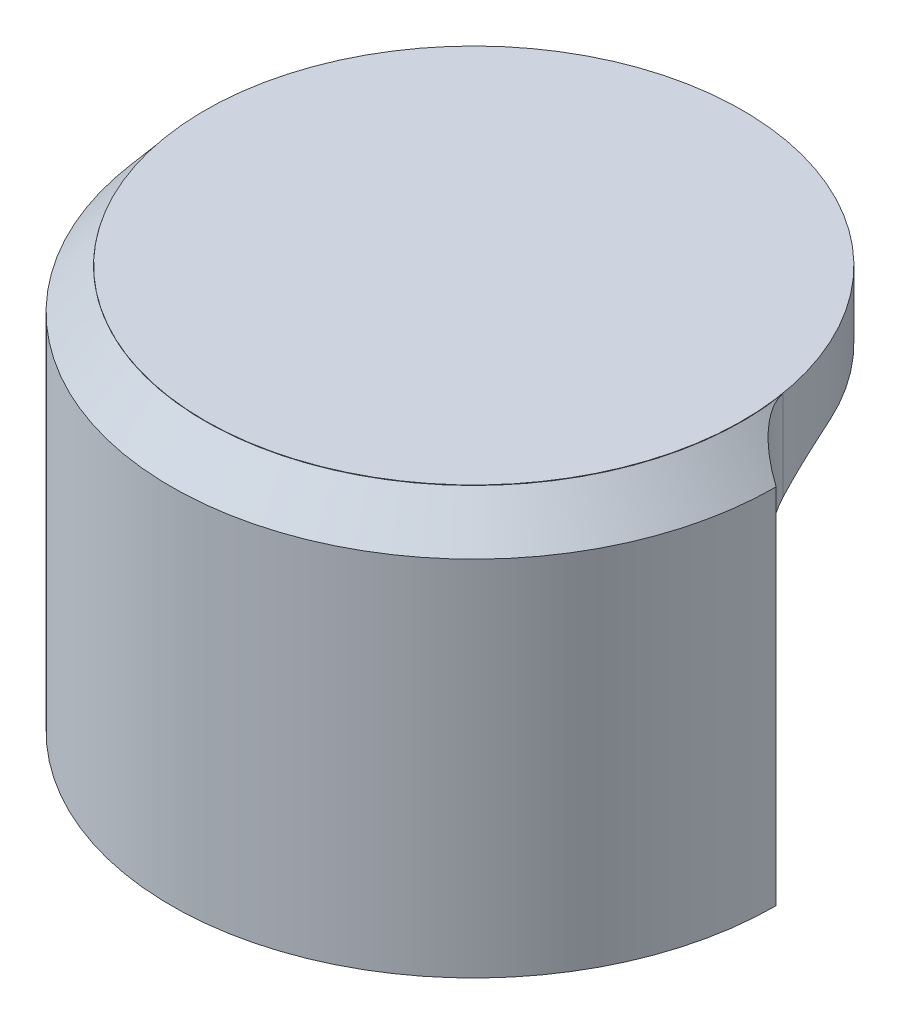
ISO-10303-21;
HEADER;
FILE_DESCRIPTION(('STEP AP214'),'2;1');
FILE_NAME('part.step','',(''),(''),'','','');
FILE_SCHEMA(('AUTOMOTIVE_DESIGN { 1 0 10303 214 1 1 1 1 }'));
ENDSEC;
DATA;
#1=APPLICATION_CONTEXT('core data for automotive mechanical design processes');
#2=APPLICATION_PROTOCOL_DEFINITION('international standard','automotive_design',2000,#1);
#3=PRODUCT_CONTEXT('',#1,'mechanical');
#4=PRODUCT('Part','Part','',(#3));
#5=PRODUCT_RELATED_PRODUCT_CATEGORY('part','',(#4));
#6=PRODUCT_DEFINITION_FORMATION('','',#4);
#7=PRODUCT_DEFINITION_CONTEXT('part definition',#1,'design');
#8=PRODUCT_DEFINITION('design','',#6,#7);
#9=PRODUCT_DEFINITION_SHAPE('','',#8);
#10=(LENGTH_UNIT() NAMED_UNIT(*) SI_UNIT(.MILLI.,.METRE.));
#11=(NAMED_UNIT(*) PLANE_ANGLE_UNIT() SI_UNIT($,.RADIAN.));
#12=(NAMED_UNIT(*) SI_UNIT($,.STERADIAN.) SOLID_ANGLE_UNIT());
#13=UNCERTAINTY_MEASURE_WITH_UNIT(LENGTH_MEASURE(1.E-05),#10,'distance_accuracy_value','');
#14=(GEOMETRIC_REPRESENTATION_CONTEXT(3) GLOBAL_UNCERTAINTY_ASSIGNED_CONTEXT((#13)) GLOBAL_UNIT_ASSIGNED_CONTEXT((#10,
#11,#12)) REPRESENTATION_CONTEXT('',''));
#15=CARTESIAN_POINT('',(0.,0.,0.));
#16=DIRECTION('',(0.,0.,1.));
#17=DIRECTION('',(1.,0.,0.));
#18=AXIS2_PLACEMENT_3D('',#15,#16,#17);
#19=CARTESIAN_POINT('',(0.,30.,0.));
#20=DIRECTION('',(0.,-1.,0.));
#21=DIRECTION('',(0.,0.,-1.));
#22=AXIS2_PLACEMENT_3D('',#19,#20,#21);
#23=CYLINDRICAL_SURFACE('',#22,20.);
#24=CARTESIAN_POINT('',(0.,0.,0.));
#25=DIRECTION('',(0.,-1.,0.));
#26=DIRECTION('',(0.,0.,-1.));
#27=AXIS2_PLACEMENT_3D('',#24,#25,#26);
#28=CIRCLE('',#27,20.);
#29=CARTESIAN_POINT('',(20.,0.,0.));
#30=VERTEX_POINT('',#29);
#31=CARTESIAN_POINT('',(-20.,0.,0.));
#32=VERTEX_POINT('',#31);
#33=EDGE_CURVE('E127',#30,#32,#28,.T.);
#34=ORIENTED_EDGE('',*,*,#33,.T.);
#35=DIRECTION('',(0.,-1.,0.));
#36=VECTOR('',#35,1.);
#37=CARTESIAN_POINT('',(-20.,30.,0.));
#38=LINE('',#37,#36);
#39=CARTESIAN_POINT('',(-20.,20.,0.));
#40=VERTEX_POINT('',#39);
#41=EDGE_CURVE('E113',#40,#32,#38,.T.);
#42=ORIENTED_EDGE('',*,*,#41,.F.);
#43=CARTESIAN_POINT('',(-20.,20.,0.));
#44=CARTESIAN_POINT('',(-19.9999557370953,20.2805626373853,2.9943857944968E-05));
#45=CARTESIAN_POINT('',(-19.9999986078176,20.5611210251892,-0.0118060572730324));
#46=CARTESIAN_POINT('',(-19.9999387337623,21.1202432263666,-0.0589939019382653));
#47=CARTESIAN_POINT('',(-19.9998359944431,21.3988071141145,-0.0943448639401671));
#48=CARTESIAN_POINT('',(-19.9991651639557,21.9518916713769,-0.188332355567512));
#49=CARTESIAN_POINT('',(-19.9985972139569,22.2264135417299,-0.246961818491311));
#50=CARTESIAN_POINT('',(-19.9963773522755,22.7695525530659,-0.387080348755982));
#51=CARTESIAN_POINT('',(-19.9947254540536,23.0381697673315,-0.468569132217734));
#52=CARTESIAN_POINT('',(-19.989522603102,23.5677616164803,-0.653886785261698));
#53=CARTESIAN_POINT('',(-19.9859704300935,23.8287312266746,-0.757729984299086));
#54=CARTESIAN_POINT('',(-19.9759617833958,24.3409674737002,-0.986968781670475));
#55=CARTESIAN_POINT('',(-19.9695053549892,24.5922342617499,-1.11236404394935));
#56=CARTESIAN_POINT('',(-19.9525359716774,25.0832085593254,-1.38375620847462));
#57=CARTESIAN_POINT('',(-19.9420234855485,25.3229174010533,-1.52975072873829));
#58=CARTESIAN_POINT('',(-19.9156807366992,25.7890239179821,-1.84121562157234));
#59=CARTESIAN_POINT('',(-19.8998505678017,26.0154218279526,-2.00668565049168));
#60=CARTESIAN_POINT('',(-19.8617485317303,26.4509585511862,-2.35396115093738));
#61=CARTESIAN_POINT('',(-19.8395441677449,26.6602501346368,-2.53558234570398));
#62=CARTESIAN_POINT('',(-19.7873511781658,27.0625518023257,-2.91502911047923));
#63=CARTESIAN_POINT('',(-19.7573625822775,27.2555619486918,-3.11285461864856));
#64=CARTESIAN_POINT('',(-19.6884046394683,27.6237303156232,-3.52276504570011));
#65=CARTESIAN_POINT('',(-19.6494418276717,27.7989013935786,-3.73483950912087));
#66=CARTESIAN_POINT('',(-19.5614292641474,28.1302973958213,-4.17133454832747));
#67=CARTESIAN_POINT('',(-19.5123799914951,28.286523219389,-4.39575453736869));
#68=CARTESIAN_POINT('',(-19.4055291021525,28.5730280044983,-4.84526519222889));
#69=CARTESIAN_POINT('',(-19.3481692420369,28.7041086431448,-5.06995042531681));
#70=CARTESIAN_POINT('',(-19.2227487020385,28.947317246645,-5.52647769706414));
#71=CARTESIAN_POINT('',(-19.154688097627,29.0594453451578,-5.75831968523834));
#72=CARTESIAN_POINT('',(-19.007432782435,29.2645281224053,-6.22719365358695));
#73=CARTESIAN_POINT('',(-18.9282267177046,29.3574630076423,-6.46423071549735));
#74=CARTESIAN_POINT('',(-18.7586219733123,29.5239993517451,-6.94104569878217));
#75=CARTESIAN_POINT('',(-18.6682242367918,29.597602438105,-7.1808233876556));
#76=CARTESIAN_POINT('',(-18.4852716379337,29.7198302561806,-7.63870144767882));
#77=CARTESIAN_POINT('',(-18.3936964321844,29.7701397092871,-7.85674735972423));
#78=CARTESIAN_POINT('',(-18.2016664772038,29.8555380220128,-8.29191863880495));
#79=CARTESIAN_POINT('',(-18.101211179975,29.8906259415087,-8.50904394816144));
#80=CARTESIAN_POINT('',(-17.8919969567306,29.9460956297941,-8.94056832620431));
#81=CARTESIAN_POINT('',(-17.7832558670354,29.9665080528281,-9.1549721532543));
#82=CARTESIAN_POINT('',(-17.5577747522793,29.9934653907493,-9.58033020860675));
#83=CARTESIAN_POINT('',(-17.4410375485944,30.0000151712221,-9.7912856214477));
#84=CARTESIAN_POINT('',(-17.3205080756888,30.,-10.));
#85=B_SPLINE_CURVE_WITH_KNOTS('',3,(#43,#44,#45,#46,#47,#48,#49,#50,#51,#52,#53,#54,#55,#56,#57,
#58,#59,#60,#61,#62,#63,#64,#65,#66,#67,#68,#69,#70,#71,#72,#73,#74,#75,#76,#77,#78,#79,#80,#81,
#82,#83,#84),.UNSPECIFIED.,.F.,.F.,(4,2,2,2,2,2,2,2,2,2,2,2,2,2,2,2,2,2,2,2,4),(0.,
0.841432372616268,1.68283320326807,2.5239788032209,3.36511395784561,4.20678990454418,
5.04845272842231,5.89001830677084,6.73156903767482,7.56451718005767,8.3974621438706,
9.22980245490531,10.0621032415009,10.8602498176647,11.6583907648246,12.4573507499772,
13.2562434511754,13.9809573838289,14.7057160704186,15.4289564442854,16.1519429291931),.UNSPECIFIED.);
#86=CARTESIAN_POINT('',(-17.3205080756888,30.,-10.));
#87=VERTEX_POINT('',#86);
#88=EDGE_CURVE('E11',#40,#87,#85,.T.);
#89=ORIENTED_EDGE('',*,*,#88,.T.);
#90=CARTESIAN_POINT('',(0.,30.,0.));
#91=DIRECTION('',(0.,-1.,0.));
#92=DIRECTION('',(0.,0.,-1.));
#93=AXIS2_PLACEMENT_3D('',#90,#91,#92);
#94=CIRCLE('',#93,20.);
#95=CARTESIAN_POINT('',(17.3205080756888,30.,-10.));
#96=VERTEX_POINT('',#95);
#97=EDGE_CURVE('E99',#96,#87,#94,.T.);
#98=ORIENTED_EDGE('',*,*,#97,.F.);
#99=CARTESIAN_POINT('',(17.3205080756888,30.,-10.));
#100=CARTESIAN_POINT('',(17.459612415594,30.0000289828941,-9.75915325547947));
#101=CARTESIAN_POINT('',(17.5936559303901,29.9912982661973,-9.51529333613806));
#102=CARTESIAN_POINT('',(17.8510321720107,29.9552269450601,-9.02315548704157));
#103=CARTESIAN_POINT('',(17.9743582486052,29.9278748776406,-8.77487492775037));
#104=CARTESIAN_POINT('',(18.2096966668275,29.853417275292,-8.27546730681567));
#105=CARTESIAN_POINT('',(18.3216934593926,29.8062850372674,-8.02433684540639));
#106=CARTESIAN_POINT('',(18.5336859705613,29.6914766887072,-7.52175613948921));
#107=CARTESIAN_POINT('',(18.633684333424,29.6238051163536,-7.27030597782844));
#108=CARTESIAN_POINT('',(18.8218407710521,29.4670902166284,-6.76834212010999));
#109=CARTESIAN_POINT('',(18.9099483557127,29.3779599687156,-6.51783655304953));
#110=CARTESIAN_POINT('',(19.0738581333725,29.178327741808,-6.02131990188398));
#111=CARTESIAN_POINT('',(19.1496593574931,29.0678240815861,-5.77530917300889));
#112=CARTESIAN_POINT('',(19.2891545861386,28.8258796864667,-5.29074625413785));
#113=CARTESIAN_POINT('',(19.3528668826701,28.6944711461643,-5.05218325929774));
#114=CARTESIAN_POINT('',(19.4689275565784,28.4112143223625,-4.58463553736811));
#115=CARTESIAN_POINT('',(19.5212766296463,28.2593672910921,-4.35565022459721));
#116=CARTESIAN_POINT('',(19.6126912099352,27.9457410530995,-3.92280009919124));
#117=CARTESIAN_POINT('',(19.6523591542812,27.7850800902642,-3.71825052877836));
#118=CARTESIAN_POINT('',(19.7232936928387,27.4475068264008,-3.32149114715562));
#119=CARTESIAN_POINT('',(19.7545605865166,27.2705951049537,-3.12928089628082));
#120=CARTESIAN_POINT('',(19.8097149968838,26.9015743178437,-2.75868119688005));
#121=CARTESIAN_POINT('',(19.8335980592366,26.7094561662398,-2.58030013931034));
#122=CARTESIAN_POINT('',(19.8750343291867,26.3114025127017,-2.23888172518596));
#123=CARTESIAN_POINT('',(19.8925873914606,26.1054666936718,-2.07584472096174));
#124=CARTESIAN_POINT('',(19.9227019851648,25.6776728071139,-1.76378269350275));
#125=CARTESIAN_POINT('',(19.9351768619137,25.455608883857,-1.61503156933063));
#126=CARTESIAN_POINT('',(19.9558389477264,25.0001398792703,-1.33570692752737));
#127=CARTESIAN_POINT('',(19.9640260730185,24.7667345764565,-1.20513376508324));
#128=CARTESIAN_POINT('',(19.9771666714359,24.2901502617058,-0.963073362964116));
#129=CARTESIAN_POINT('',(19.9821201958237,24.0469714047744,-0.851585820744583));
#130=CARTESIAN_POINT('',(19.989743941604,23.5524334729352,-0.648439976445167));
#131=CARTESIAN_POINT('',(19.9924141652643,23.3010744061514,-0.556781654672755));
#132=CARTESIAN_POINT('',(19.9962189021077,22.8007565537338,-0.396755504012646));
#133=CARTESIAN_POINT('',(19.9974040220749,22.5520231169728,-0.327683189203371));
#134=CARTESIAN_POINT('',(19.9989958117031,22.0499618061518,-0.20897345033782));
#135=CARTESIAN_POINT('',(19.9994024966261,21.7966340222662,-0.159335645266037));
#136=CARTESIAN_POINT('',(19.9998827127155,21.2868679523363,-0.0797935346938577));
#137=CARTESIAN_POINT('',(19.9999562030292,21.0304292887339,-0.0498916493837689));
#138=CARTESIAN_POINT('',(19.9999989843423,20.5159948291556,-0.00998366544209926));
#139=CARTESIAN_POINT('',(19.9999682696628,20.2579989490815,2.1348830103851E-05));
#140=CARTESIAN_POINT('',(20.,20.,0.));
#141=B_SPLINE_CURVE_WITH_KNOTS('',3,(#99,#100,#101,#102,#103,#104,#105,#106,#107,#108,#109,#110,
#111,#112,#113,#114,#115,#116,#117,#118,#119,#120,#121,#122,#123,#124,#125,#126,#127,#128,#129,
#130,#131,#132,#133,#134,#135,#136,#137,#138,#139,#140),.UNSPECIFIED.,.F.,.F.,(4,2,2,2,2,2,2,2,
2,2,2,2,2,2,2,2,2,2,2,2,4),(0.,0.834312350280991,1.66913875364591,2.50509581083416,
3.34086829694701,4.18008487221365,5.01936748690845,5.85736985767487,6.6953209089178,
7.48372262446206,8.27209623268632,9.06094450777077,9.84981089198667,10.6516249580703,
11.4534546889452,12.2552717080681,13.0570879308976,13.8307645145586,14.6044259294532,
15.378182199828,16.1519806379827),.UNSPECIFIED.);
#142=CARTESIAN_POINT('',(20.,20.,0.));
#143=VERTEX_POINT('',#142);
#144=EDGE_CURVE('E120',#96,#143,#141,.T.);
#145=ORIENTED_EDGE('',*,*,#144,.T.);
#146=DIRECTION('',(0.,-1.,0.));
#147=VECTOR('',#146,1.);
#148=CARTESIAN_POINT('',(20.,30.,0.));
#149=LINE('',#148,#147);
#150=EDGE_CURVE('E344',#143,#30,#149,.T.);
#151=ORIENTED_EDGE('',*,*,#150,.T.);
#152=EDGE_LOOP('',(#34,#42,#89,#98,#145,#151));
#153=FACE_BOUND('',#152,.T.);
#154=ADVANCED_FACE('F45',(#153),#23,.F.);
#155=CARTESIAN_POINT('',(-27.,30.,0.));
#156=DIRECTION('',(0.,0.,1.));
#157=DIRECTION('',(1.,0.,0.));
#158=AXIS2_PLACEMENT_3D('',#155,#156,#157);
#159=PLANE('',#158);
#160=DIRECTION('',(0.,-1.,0.));
#161=VECTOR('',#160,1.);
#162=CARTESIAN_POINT('',(-27.,30.,0.));
#163=LINE('',#162,#161);
#164=CARTESIAN_POINT('',(-27.,20.,0.));
#165=VERTEX_POINT('',#164);
#166=CARTESIAN_POINT('',(-27.,0.,0.));
#167=VERTEX_POINT('',#166);
#168=EDGE_CURVE('E115',#165,#167,#163,.T.);
#169=ORIENTED_EDGE('',*,*,#168,.F.);
#170=DIRECTION('',(-1.,0.,0.));
#171=VECTOR('',#170,1.);
#172=CARTESIAN_POINT('',(-20.,20.,0.));
#173=LINE('',#172,#171);
#174=EDGE_CURVE('E108',#165,#40,#173,.F.);
#175=ORIENTED_EDGE('',*,*,#174,.T.);
#176=ORIENTED_EDGE('',*,*,#41,.T.);
#177=DIRECTION('',(-1.,0.,0.));
#178=VECTOR('',#177,1.);
#179=CARTESIAN_POINT('',(-27.,0.,0.));
#180=LINE('',#179,#178);
#181=EDGE_CURVE('E339',#32,#167,#180,.T.);
#182=ORIENTED_EDGE('',*,*,#181,.T.);
#183=EDGE_LOOP('',(#169,#175,#176,#182));
#184=FACE_BOUND('',#183,.T.);
#185=ADVANCED_FACE('F110',(#184),#159,.F.);
#186=CARTESIAN_POINT('',(0.,30.,0.));
#187=DIRECTION('',(0.,-1.,0.));
#188=DIRECTION('',(0.,0.,-1.));
#189=AXIS2_PLACEMENT_3D('',#186,#187,#188);
#190=CYLINDRICAL_SURFACE('',#189,27.);
#191=CARTESIAN_POINT('',(0.,0.,0.));
#192=DIRECTION('',(0.,1.,0.));
#193=DIRECTION('',(0.,0.,1.));
#194=AXIS2_PLACEMENT_3D('',#191,#192,#193);
#195=CIRCLE('',#194,27.);
#196=CARTESIAN_POINT('',(27.,0.,0.));
#197=VERTEX_POINT('',#196);
#198=EDGE_CURVE('E349',#167,#197,#195,.T.);
#199=ORIENTED_EDGE('',*,*,#198,.T.);
#200=DIRECTION('',(0.,-1.,0.));
#201=VECTOR('',#200,1.);
#202=CARTESIAN_POINT('',(27.,30.,0.));
#203=LINE('',#202,#201);
#204=CARTESIAN_POINT('',(27.,20.,0.));
#205=VERTEX_POINT('',#204);
#206=EDGE_CURVE('E358',#205,#197,#203,.T.);
#207=ORIENTED_EDGE('',*,*,#206,.F.);
#208=CARTESIAN_POINT('',(27.,32.3835071851885,0.));
#209=VERTEX_POINT('',#208);
#210=EDGE_CURVE('E90',#209,#205,#203,.T.);
#211=ORIENTED_EDGE('',*,*,#210,.F.);
#212=CARTESIAN_POINT('',(0.,32.3835071851885,0.));
#213=DIRECTION('',(0.,-1.,0.));
#214=DIRECTION('',(0.,0.,-1.));
#215=AXIS2_PLACEMENT_3D('',#212,#213,#214);
#216=CIRCLE('',#215,27.);
#217=CARTESIAN_POINT('',(-27.,32.3835071851885,0.));
#218=VERTEX_POINT('',#217);
#219=EDGE_CURVE('E366',#209,#218,#216,.T.);
#220=ORIENTED_EDGE('',*,*,#219,.T.);
#221=EDGE_CURVE('E67',#218,#165,#163,.T.);
#222=ORIENTED_EDGE('',*,*,#221,.T.);
#223=ORIENTED_EDGE('',*,*,#168,.T.);
#224=EDGE_LOOP('',(#199,#207,#211,#220,#222,#223));
#225=FACE_BOUND('',#224,.T.);
#226=ADVANCED_FACE('F212',(#225),#190,.T.);
#227=CARTESIAN_POINT('',(20.,30.,0.));
#228=DIRECTION('',(0.,0.,1.));
#229=DIRECTION('',(1.,0.,0.));
#230=AXIS2_PLACEMENT_3D('',#227,#228,#229);
#231=PLANE('',#230);
#232=ORIENTED_EDGE('',*,*,#150,.F.);
#233=DIRECTION('',(-1.,0.,0.));
#234=VECTOR('',#233,1.);
#235=CARTESIAN_POINT('',(27.,20.,0.));
#236=LINE('',#235,#234);
#237=EDGE_CURVE('E121',#143,#205,#236,.F.);
#238=ORIENTED_EDGE('',*,*,#237,.T.);
#239=ORIENTED_EDGE('',*,*,#206,.T.);
#240=DIRECTION('',(-1.,0.,0.));
#241=VECTOR('',#240,1.);
#242=CARTESIAN_POINT('',(20.,0.,0.));
#243=LINE('',#242,#241);
#244=EDGE_CURVE('E345',#197,#30,#243,.T.);
#245=ORIENTED_EDGE('',*,*,#244,.T.);
#246=EDGE_LOOP('',(#232,#238,#239,#245));
#247=FACE_BOUND('',#246,.T.);
#248=ADVANCED_FACE('F208',(#247),#231,.F.);
#249=CARTESIAN_POINT('',(0.,0.,0.));
#250=DIRECTION('',(0.,-1.,0.));
#251=DIRECTION('',(0.,0.,-1.));
#252=AXIS2_PLACEMENT_3D('',#249,#250,#251);
#253=PLANE('',#252);
#254=ORIENTED_EDGE('',*,*,#33,.F.);
#255=ORIENTED_EDGE('',*,*,#244,.F.);
#256=ORIENTED_EDGE('',*,*,#198,.F.);
#257=ORIENTED_EDGE('',*,*,#181,.F.);
#258=EDGE_LOOP('',(#254,#255,#256,#257));
#259=FACE_BOUND('',#258,.T.);
#260=ADVANCED_FACE('F204',(#259),#253,.T.);
#261=CARTESIAN_POINT('',(0.,30.,0.));
#262=DIRECTION('',(0.,1.,0.));
#263=DIRECTION('',(0.,0.,1.));
#264=AXIS2_PLACEMENT_3D('',#261,#262,#263);
#265=PLANE('',#264);
#266=CARTESIAN_POINT('',(0.,30.,0.));
#267=DIRECTION('',(0.,1.,0.));
#268=DIRECTION('',(0.,0.,1.));
#269=AXIS2_PLACEMENT_3D('',#266,#267,#268);
#270=CIRCLE('',#269,24.);
#271=CARTESIAN_POINT('',(21.8174242292714,30.,-10.));
#272=VERTEX_POINT('',#271);
#273=CARTESIAN_POINT('',(-21.8174242292714,30.,-10.));
#274=VERTEX_POINT('',#273);
#275=EDGE_CURVE('E335',#272,#274,#270,.T.);
#276=ORIENTED_EDGE('',*,*,#275,.F.);
#277=DIRECTION('',(-1.,0.,0.));
#278=VECTOR('',#277,1.);
#279=CARTESIAN_POINT('',(20.,30.,-10.));
#280=LINE('',#279,#278);
#281=EDGE_CURVE('E139',#272,#96,#280,.T.);
#282=ORIENTED_EDGE('',*,*,#281,.T.);
#283=ORIENTED_EDGE('',*,*,#97,.T.);
#284=DIRECTION('',(-1.,0.,0.));
#285=VECTOR('',#284,1.);
#286=CARTESIAN_POINT('',(-27.,30.,-10.));
#287=LINE('',#286,#285);
#288=EDGE_CURVE('E133',#87,#274,#287,.T.);
#289=ORIENTED_EDGE('',*,*,#288,.T.);
#290=EDGE_LOOP('',(#276,#282,#283,#289));
#291=FACE_BOUND('',#290,.T.);
#292=ADVANCED_FACE('F201',(#291),#265,.F.);
#293=CARTESIAN_POINT('',(0.,36.,0.));
#294=DIRECTION('',(0.,-1.,0.));
#295=DIRECTION('',(0.,0.,-1.));
#296=AXIS2_PLACEMENT_3D('',#293,#294,#295);
#297=CYLINDRICAL_SURFACE('',#296,24.);
#298=CARTESIAN_POINT('',(0.,36.,0.));
#299=DIRECTION('',(0.,1.,0.));
#300=DIRECTION('',(0.,0.,1.));
#301=AXIS2_PLACEMENT_3D('',#298,#299,#300);
#302=CIRCLE('',#301,24.);
#303=CARTESIAN_POINT('',(0.,36.,24.));
#304=VERTEX_POINT('',#303);
#305=EDGE_CURVE('E333',#304,#304,#302,.T.);
#306=ORIENTED_EDGE('',*,*,#305,.F.);
#307=EDGE_LOOP('',(#306));
#308=FACE_BOUND('',#307,.T.);
#309=CARTESIAN_POINT('',(0.,35.9587679629712,0.));
#310=DIRECTION('',(0.,-1.,0.));
#311=DIRECTION('',(0.,0.,-1.));
#312=AXIS2_PLACEMENT_3D('',#309,#310,#311);
#313=CIRCLE('',#312,24.);
#314=CARTESIAN_POINT('',(-23.6781609195402,35.9587679629712,-3.91723058656978));
#315=VERTEX_POINT('',#314);
#316=CARTESIAN_POINT('',(23.6781609195402,35.9587679629712,-3.91723058656978));
#317=VERTEX_POINT('',#316);
#318=EDGE_CURVE('E129',#315,#317,#313,.F.);
#319=ORIENTED_EDGE('',*,*,#318,.T.);
#320=DIRECTION('',(0.,-1.,0.));
#321=VECTOR('',#320,1.);
#322=CARTESIAN_POINT('',(23.6781609195402,36.,-3.91723058656978));
#323=LINE('',#322,#321);
#324=CARTESIAN_POINT('',(23.6781609195402,27.9372486582592,-3.91723058656978));
#325=VERTEX_POINT('',#324);
#326=EDGE_CURVE('E371',#317,#325,#323,.T.);
#327=ORIENTED_EDGE('',*,*,#326,.T.);
#328=CARTESIAN_POINT('',(23.6781609195402,27.9372486582592,-3.91723058656978));
#329=CARTESIAN_POINT('',(23.6602250004101,28.0203368719418,-4.02564911704983));
#330=CARTESIAN_POINT('',(23.6412610729326,28.1011092262715,-4.13565007670976));
#331=CARTESIAN_POINT('',(23.6011748353439,28.2579149320483,-4.35859794492915));
#332=CARTESIAN_POINT('',(23.5800525115848,28.3339482535249,-4.47154487211298));
#333=CARTESIAN_POINT('',(23.5133126208748,28.5547181043687,-4.81438236611521));
#334=CARTESIAN_POINT('',(23.4643078967524,28.6921914053207,-5.04835705090066));
#335=CARTESIAN_POINT('',(23.3582171862088,28.9432664918428,-5.51815570586702));
#336=CARTESIAN_POINT('',(23.3013997135546,29.0574345796938,-5.75373916498656));
#337=CARTESIAN_POINT('',(23.1783333613284,29.2662082980369,-6.23101837513728));
#338=CARTESIAN_POINT('',(23.112084890047,29.3608147749639,-6.47271386119174));
#339=CARTESIAN_POINT('',(22.9633946844892,29.538132585637,-6.98279540713525));
#340=CARTESIAN_POINT('',(22.8800209436787,29.6189268771735,-7.25157787295737));
#341=CARTESIAN_POINT('',(22.7018557972425,29.7570471570442,-7.79144419074445));
#342=CARTESIAN_POINT('',(22.6070606141325,29.8143653532575,-8.06252877639771));
#343=CARTESIAN_POINT('',(22.4031635796348,29.9074314891828,-8.61319610278034));
#344=CARTESIAN_POINT('',(22.2937007072249,29.9424296352294,-8.89277289490351));
#345=CARTESIAN_POINT('',(22.1211885286794,29.977142047312,-9.30997894841595));
#346=CARTESIAN_POINT('',(22.0623077135226,29.9857487593338,-9.44866691654882));
#347=CARTESIAN_POINT('',(21.9418602175512,29.9971772816527,-9.72509652971378));
#348=CARTESIAN_POINT('',(21.8802938011427,29.9999996601293,-9.8628382663668));
#349=CARTESIAN_POINT('',(21.8174242292714,30.,-10.));
#350=B_SPLINE_CURVE_WITH_KNOTS('',3,(#328,#329,#330,#331,#332,#333,#334,#335,#336,#337,#338,
#339,#340,#341,#342,#343,#344,#345,#346,#347,#348,#349),.UNSPECIFIED.,.F.,.F.,(4,2,2,2,2,2,2,2,
2,2,4),(0.,0.413235257339747,0.826473127779157,1.65261707161379,2.45533802552639,
3.25802423827354,4.1351571314558,5.01258092470106,5.91811188389146,6.37074015356759,
6.82332396066913),.UNSPECIFIED.);
#351=EDGE_CURVE('E182',#325,#272,#350,.T.);
#352=ORIENTED_EDGE('',*,*,#351,.T.);
#353=ORIENTED_EDGE('',*,*,#275,.T.);
#354=CARTESIAN_POINT('',(-21.8174242292714,30.,-10.));
#355=CARTESIAN_POINT('',(-21.9354885422068,30.0000340373918,-9.74251935151873));
#356=CARTESIAN_POINT('',(-22.0489443941465,29.9900553733653,-9.48285094585129));
#357=CARTESIAN_POINT('',(-22.2661261450824,29.9493103627414,-8.9609697713506));
#358=CARTESIAN_POINT('',(-22.3698479575053,29.9185353294201,-8.69875598443165));
#359=CARTESIAN_POINT('',(-22.5640743261323,29.8366460092279,-8.18148947109453));
#360=CARTESIAN_POINT('',(-22.6548761685531,29.7861511878118,-7.92645096520168));
#361=CARTESIAN_POINT('',(-22.8264206465051,29.6644452234956,-7.41798255435074));
#362=CARTESIAN_POINT('',(-22.9071650990481,29.5932378303944,-7.16455236670159));
#363=CARTESIAN_POINT('',(-23.0612427380383,29.4269842410977,-6.65230583690256));
#364=CARTESIAN_POINT('',(-23.1342028657491,29.331169859861,-6.39362560536962));
#365=CARTESIAN_POINT('',(-23.2693695580381,29.1172728945167,-5.88271205430811));
#366=CARTESIAN_POINT('',(-23.3315746836787,28.9991873351072,-5.63047960128427));
#367=CARTESIAN_POINT('',(-23.4473918574339,28.737220679108,-5.12723157041414));
#368=CARTESIAN_POINT('',(-23.5006778259875,28.5926535271824,-4.8764959960584));
#369=CARTESIAN_POINT('',(-23.5728592673081,28.3591771865314,-4.50953368694456));
#370=CARTESIAN_POINT('',(-23.5956324919129,28.2785619965969,-4.38871184247738));
#371=CARTESIAN_POINT('',(-23.6387142521204,28.1119266665627,-4.15040331459139));
#372=CARTESIAN_POINT('',(-23.6590228084477,28.02590657192,-4.03291660313501));
#373=CARTESIAN_POINT('',(-23.6781609195402,27.9372486582592,-3.91723058656978));
#374=B_SPLINE_CURVE_WITH_KNOTS('',3,(#354,#355,#356,#357,#358,#359,#360,#361,#362,#363,#364,
#365,#366,#367,#368,#369,#370,#371,#372,#373),.UNSPECIFIED.,.F.,.F.,(4,2,2,2,2,2,2,2,2,4),(0.,
0.849657346845769,1.6996698184093,2.52488806769535,3.34995701255762,4.20482870606675,
5.05981468654479,5.94129939705155,6.38222828318949,6.82315346145854),.UNSPECIFIED.);
#375=CARTESIAN_POINT('',(-23.6781609195402,27.9372486582592,-3.91723058656978));
#376=VERTEX_POINT('',#375);
#377=EDGE_CURVE('E134',#274,#376,#374,.T.);
#378=ORIENTED_EDGE('',*,*,#377,.T.);
#379=DIRECTION('',(0.,-1.,0.));
#380=VECTOR('',#379,1.);
#381=CARTESIAN_POINT('',(-23.6781609195402,36.,-3.91723058656978));
#382=LINE('',#381,#380);
#383=EDGE_CURVE('E76',#376,#315,#382,.F.);
#384=ORIENTED_EDGE('',*,*,#383,.T.);
#385=EDGE_LOOP('',(#319,#327,#352,#353,#378,#384));
#386=FACE_BOUND('',#385,.T.);
#387=ADVANCED_FACE('F195',(#308,#386),#297,.T.);
#388=CARTESIAN_POINT('',(0.,36.,0.));
#389=DIRECTION('',(0.,1.,0.));
#390=DIRECTION('',(0.,0.,1.));
#391=AXIS2_PLACEMENT_3D('',#388,#389,#390);
#392=PLANE('',#391);
#393=ORIENTED_EDGE('',*,*,#305,.T.);
#394=EDGE_LOOP('',(#393));
#395=FACE_BOUND('',#394,.T.);
#396=ADVANCED_FACE('F200',(#395),#392,.T.);
#397=CARTESIAN_POINT('',(0.,35.9587679629712,0.));
#398=DIRECTION('',(0.,-1.,0.));
#399=DIRECTION('',(0.,0.,-1.));
#400=AXIS2_PLACEMENT_3D('',#397,#398,#399);
#401=CONICAL_SURFACE('',#400,24.,0.698131700797727);
#402=ORIENTED_EDGE('',*,*,#318,.F.);
#403=CARTESIAN_POINT('',(-23.6781609195402,35.9587679629712,-3.91723058656978));
#404=CARTESIAN_POINT('',(-23.6947141090822,35.9588213305374,-3.8169632536977));
#405=CARTESIAN_POINT('',(-23.7143837134009,35.9543084110862,-3.71725147613824));
#406=CARTESIAN_POINT('',(-23.7594930707125,35.9365666247173,-3.52009290938226));
#407=CARTESIAN_POINT('',(-23.7849235690718,35.9233516730227,-3.42264276079586));
#408=CARTESIAN_POINT('',(-23.8407578638009,35.8888607733229,-3.23216460012225));
#409=CARTESIAN_POINT('',(-23.8710878283143,35.8676991141838,-3.1390940122802));
#410=CARTESIAN_POINT('',(-23.9364112761541,35.8179770117111,-2.95664333615477));
#411=CARTESIAN_POINT('',(-23.9714062779042,35.7894141564924,-2.86726446194764));
#412=CARTESIAN_POINT('',(-24.0820657230795,35.6941479250592,-2.60654366683007));
#413=CARTESIAN_POINT('',(-24.1638049836672,35.617608775281,-2.44129078389896));
#414=CARTESIAN_POINT('',(-24.3394465497093,35.4441932059517,-2.12845777560281));
#415=CARTESIAN_POINT('',(-24.4333919564813,35.3472439252907,-1.98094402315404));
#416=CARTESIAN_POINT('',(-24.6116205177155,35.1578777934892,-1.72946043552559));
#417=CARTESIAN_POINT('',(-24.6944387979956,35.0679868256481,-1.62250018159858));
#418=CARTESIAN_POINT('',(-24.8646096491892,34.8803874592986,-1.41951841304552));
#419=CARTESIAN_POINT('',(-24.9519648956497,34.7826744291374,-1.32350346220962));
#420=CARTESIAN_POINT('',(-25.1305417681457,34.5807823336822,-1.14139005567262));
#421=CARTESIAN_POINT('',(-25.2217770206973,34.4765797584899,-1.05533132107937));
#422=CARTESIAN_POINT('',(-25.4071033638097,34.2633268207812,-0.892809185839582));
#423=CARTESIAN_POINT('',(-25.501195182991,34.154275218078,-0.816348259266581));
#424=CARTESIAN_POINT('',(-25.709421197054,33.9116782816801,-0.658978808517198));
#425=CARTESIAN_POINT('',(-25.824024079506,33.7773541548811,-0.579894674162446));
#426=CARTESIAN_POINT('',(-26.0558179233783,33.5045739982797,-0.433404937362756));
#427=CARTESIAN_POINT('',(-26.1730098728175,33.3661163837522,-0.366003883248422));
#428=CARTESIAN_POINT('',(-26.4076927912789,33.088146607821,-0.243080630659132));
#429=CARTESIAN_POINT('',(-26.5251542140276,32.9486796302812,-0.187398836632481));
#430=CARTESIAN_POINT('',(-26.7615433070388,32.6675783390156,-0.0862201824644156));
#431=CARTESIAN_POINT('',(-26.8804692872358,32.525946484919,-0.0407125661855506));
#432=CARTESIAN_POINT('',(-27.,32.3835071851885,0.));
#433=B_SPLINE_CURVE_WITH_KNOTS('',3,(#403,#404,#405,#406,#407,#408,#409,#410,#411,#412,#413,
#414,#415,#416,#417,#418,#419,#420,#421,#422,#423,#424,#425,#426,#427,#428,#429,#430,#431,#432),
.UNSPECIFIED.,.F.,.F.,(4,2,2,2,2,2,2,2,2,2,2,2,2,2,4),(0.,0.304661952756961,0.608837906681415,
0.908797084219575,1.20885413498726,1.80480185932232,2.4029142407238,2.8894963020483,
3.37636864362191,3.86512089955223,4.35399888592173,4.93393847250811,5.51410333028451,
6.08576665818694,6.65682273550527),.UNSPECIFIED.);
#434=EDGE_CURVE('E140',#315,#218,#433,.T.);
#435=ORIENTED_EDGE('',*,*,#434,.T.);
#436=ORIENTED_EDGE('',*,*,#219,.F.);
#437=CARTESIAN_POINT('',(27.,32.3835071851885,0.));
#438=CARTESIAN_POINT('',(26.918449250416,32.4806939858123,-0.0277628960497312));
#439=CARTESIAN_POINT('',(26.8371964094848,32.5774781955349,-0.0577660075404997));
#440=CARTESIAN_POINT('',(26.6753594297343,32.7700880065515,-0.122412638293526));
#441=CARTESIAN_POINT('',(26.5947754424115,32.8659133916283,-0.15705717994616));
#442=CARTESIAN_POINT('',(26.3535234706521,33.1524485241849,-0.268481030839524));
#443=CARTESIAN_POINT('',(26.1940349191792,33.341406419179,-0.352522497655827));
#444=CARTESIAN_POINT('',(25.8772857978647,33.7149468717021,-0.542757602067206));
#445=CARTESIAN_POINT('',(25.7200847014583,33.8994354476754,-0.649235976775763));
#446=CARTESIAN_POINT('',(25.41205551277,34.2579086037433,-0.885765352528311));
#447=CARTESIAN_POINT('',(25.2612150620151,34.4319138642171,-1.01576777306472));
#448=CARTESIAN_POINT('',(25.0523397650968,34.6693475866266,-1.22009385336427));
#449=CARTESIAN_POINT('',(24.9906800352511,34.7389751396189,-1.28360591111946));
#450=CARTESIAN_POINT('',(24.8692461454165,34.8749716128039,-1.4157163712729));
#451=CARTESIAN_POINT('',(24.8094719661164,34.9413405663742,-1.48431472155449));
#452=CARTESIAN_POINT('',(24.6336263751288,35.1345283313902,-1.69792031480032));
#453=CARTESIAN_POINT('',(24.5208151959041,35.2556757473747,-1.8509462428888));
#454=CARTESIAN_POINT('',(24.3061651175466,35.4781033223587,-2.18247092221893));
#455=CARTESIAN_POINT('',(24.2045038932351,35.5790783832852,-2.36129922047334));
#456=CARTESIAN_POINT('',(24.0662416382908,35.7071848859354,-2.64638718661375));
#457=CARTESIAN_POINT('',(24.0225791509177,35.7459547828776,-2.74406950143253));
#458=CARTESIAN_POINT('',(23.9407361067746,35.8146570008631,-2.94465607155414));
#459=CARTESIAN_POINT('',(23.9025520852545,35.844594920288,-3.04755697022658));
#460=CARTESIAN_POINT('',(23.8267733541671,35.8986269470929,-3.27500606029227));
#461=CARTESIAN_POINT('',(23.7902828654383,35.9209806941529,-3.40035456395023));
#462=CARTESIAN_POINT('',(23.7427200366507,35.9435472671519,-3.59176686448986));
#463=CARTESIAN_POINT('',(23.7280268522845,35.9492425646592,-3.6563420017071));
#464=CARTESIAN_POINT('',(23.7011710228565,35.9568567854438,-3.78627433764414));
#465=CARTESIAN_POINT('',(23.6890098109168,35.9587735752164,-3.85163195724636));
#466=CARTESIAN_POINT('',(23.6781609195402,35.9587679629712,-3.91723058656978));
#467=B_SPLINE_CURVE_WITH_KNOTS('',3,(#437,#438,#439,#440,#441,#442,#443,#444,#445,#446,#447,
#448,#449,#450,#451,#452,#453,#454,#455,#456,#457,#458,#459,#460,#461,#462,#463,#464,#465,#466),
.UNSPECIFIED.,.F.,.F.,(4,2,2,2,2,2,2,2,2,2,2,2,2,2,4),(0.,0.38957089927219,0.779227752744937,
1.5617798394738,2.35493572049908,3.1464719370772,3.48418684003145,3.82189828307068,
4.49616031282956,5.17995504409375,5.52086000324988,5.86154840420542,6.25760288523168,
6.45687318120624,6.65625596139341),.UNSPECIFIED.);
#468=EDGE_CURVE('E147',#209,#317,#467,.T.);
#469=ORIENTED_EDGE('',*,*,#468,.T.);
#470=EDGE_LOOP('',(#402,#435,#436,#469));
#471=FACE_BOUND('',#470,.T.);
#472=ADVANCED_FACE('F228',(#471),#401,.T.);
#473=CARTESIAN_POINT('',(28.6111111111111,30.,-4.73332029210515));
#474=DIRECTION('',(0.,1.,0.));
#475=DIRECTION('',(0.,0.,1.));
#476=AXIS2_PLACEMENT_3D('',#473,#474,#475);
#477=CYLINDRICAL_SURFACE('',#476,5.);
#478=ORIENTED_EDGE('',*,*,#468,.F.);
#479=ORIENTED_EDGE('',*,*,#210,.T.);
#480=CARTESIAN_POINT('',(27.,20.,0.));
#481=CARTESIAN_POINT('',(27.0002191640993,20.1225245675793,2.62189278292786E-05));
#482=CARTESIAN_POINT('',(26.9933805377593,20.2448663302592,-0.00225036548078145));
#483=CARTESIAN_POINT('',(26.9674721106438,20.4875511545453,-0.011164977093663));
#484=CARTESIAN_POINT('',(26.9484582819047,20.6079007902994,-0.0177830489319612));
#485=CARTESIAN_POINT('',(26.900440101632,20.8441984636752,-0.0350013703200173));
#486=CARTESIAN_POINT('',(26.8716006688198,20.9601861278483,-0.0455361305468437));
#487=CARTESIAN_POINT('',(26.8061467035504,21.1896571076608,-0.0703452300624797));
#488=CARTESIAN_POINT('',(26.7695219613306,21.303136916602,-0.0846244857360764));
#489=CARTESIAN_POINT('',(26.6909012580587,21.5264382076481,-0.116549648128635));
#490=CARTESIAN_POINT('',(26.6489611317811,21.636284566905,-0.134161382310961));
#491=CARTESIAN_POINT('',(26.5609748068052,21.8537416908997,-0.172699794287502));
#492=CARTESIAN_POINT('',(26.5149274468556,21.9613518127079,-0.193627410898529));
#493=CARTESIAN_POINT('',(26.3724454897392,22.2813311333678,-0.261255389812484));
#494=CARTESIAN_POINT('',(26.2717033168022,22.4907637463811,-0.312788423775993));
#495=CARTESIAN_POINT('',(26.0638309087202,22.9062156732135,-0.429158196747686));
#496=CARTESIAN_POINT('',(25.9566340243549,23.1121537270095,-0.494161181805166));
#497=CARTESIAN_POINT('',(25.7410390469384,23.5187488413057,-0.637051598099658));
#498=CARTESIAN_POINT('',(25.6326414412846,23.7194079405146,-0.714933968128247));
#499=CARTESIAN_POINT('',(25.3948233438085,24.1575458510759,-0.90149620203286));
#500=CARTESIAN_POINT('',(25.2657550686415,24.3939335191442,-1.01320994578996));
#501=CARTESIAN_POINT('',(25.0136742064824,24.8598409516708,-1.25637387078149));
#502=CARTESIAN_POINT('',(24.8906635933294,25.0893584681179,-1.3878304292801));
#503=CARTESIAN_POINT('',(24.6552498591361,25.5388630692667,-1.66988777113154));
#504=CARTESIAN_POINT('',(24.542766166733,25.7589141131636,-1.82031809713679));
#505=CARTESIAN_POINT('',(24.3309387630738,26.1901061756253,-2.14157371880083));
#506=CARTESIAN_POINT('',(24.2315878075196,26.401252062322,-2.31238767062757));
#507=CARTESIAN_POINT('',(24.0360205614087,26.8447181691293,-2.70275326400128));
#508=CARTESIAN_POINT('',(23.942628261075,27.0753111281784,-2.92576117167154));
#509=CARTESIAN_POINT('',(23.8249466377307,27.4084875382116,-3.28129407900235));
#510=CARTESIAN_POINT('',(23.7893566823977,27.5178408055979,-3.40384372861649));
#511=CARTESIAN_POINT('',(23.7269142186248,27.7315026329403,-3.65561823096428));
#512=CARTESIAN_POINT('',(23.7000711500195,27.8358056398999,-3.78485012224851));
#513=CARTESIAN_POINT('',(23.6781609195402,27.9372486582592,-3.91723058656978));
#514=B_SPLINE_CURVE_WITH_KNOTS('',3,(#480,#481,#482,#483,#484,#485,#486,#487,#488,#489,#490,
#491,#492,#493,#494,#495,#496,#497,#498,#499,#500,#501,#502,#503,#504,#505,#506,#507,#508,#509,
#510,#511,#512,#513),.UNSPECIFIED.,.F.,.F.,(4,2,2,2,2,2,2,2,2,2,2,2,2,2,2,2,4),(0.,
0.367071703995594,0.732467898437236,1.09201076196512,1.4520280764056,1.80853618332528,
2.16514540838143,2.87863980848089,3.60152941294245,4.32413561579231,5.19809562336642,
6.07233854445803,6.93922266609933,7.80562658244711,8.8050721009499,9.30885870556786,
9.81318722090468),.UNSPECIFIED.);
#515=EDGE_CURVE('E165',#205,#325,#514,.T.);
#516=ORIENTED_EDGE('',*,*,#515,.T.);
#517=ORIENTED_EDGE('',*,*,#326,.F.);
#518=EDGE_LOOP('',(#478,#479,#516,#517));
#519=FACE_BOUND('',#518,.T.);
#520=ADVANCED_FACE('F270',(#519),#477,.F.);
#521=CARTESIAN_POINT('',(-28.6111111111111,30.,-4.73332029210515));
#522=DIRECTION('',(0.,-1.,0.));
#523=DIRECTION('',(0.,0.,-1.));
#524=AXIS2_PLACEMENT_3D('',#521,#522,#523);
#525=CYLINDRICAL_SURFACE('',#524,5.);
#526=ORIENTED_EDGE('',*,*,#383,.F.);
#527=CARTESIAN_POINT('',(-23.6781609195402,27.9372486582592,-3.91723058656978));
#528=CARTESIAN_POINT('',(-23.7060381228896,27.8082454949002,-3.74885642988566));
#529=CARTESIAN_POINT('',(-23.7418778312423,27.6745948360362,-3.58559220873879));
#530=CARTESIAN_POINT('',(-23.8272166016209,27.3994493734514,-3.27008613396446));
#531=CARTESIAN_POINT('',(-23.8766908777129,27.2579691723241,-3.11782490626419));
#532=CARTESIAN_POINT('',(-23.9865858012484,26.9696202792688,-2.82601268504542));
#533=CARTESIAN_POINT('',(-24.0468895373154,26.8228213464402,-2.68634779917699));
#534=CARTESIAN_POINT('',(-24.1769643004795,26.5233517911492,-2.4180265814782));
#535=CARTESIAN_POINT('',(-24.2467408967421,26.3706777527886,-2.2893767986103));
#536=CARTESIAN_POINT('',(-24.4255121797094,25.9940753318318,-1.99057144052107));
#537=CARTESIAN_POINT('',(-24.5385410445073,25.7675281926937,-1.82611471685236));
#538=CARTESIAN_POINT('',(-24.7761804674793,25.3058306348048,-1.51913447986901));
#539=CARTESIAN_POINT('',(-24.9007949386563,25.0706773257255,-1.37661842042559));
#540=CARTESIAN_POINT('',(-25.158568405624,24.591095822522,-1.11195264202524));
#541=CARTESIAN_POINT('',(-25.2917815645839,24.3466138246715,-0.989953978084962));
#542=CARTESIAN_POINT('',(-25.5617779560287,23.8502891390498,-0.766943715250727));
#543=CARTESIAN_POINT('',(-25.698560010499,23.5984488768736,-0.665925287462704));
#544=CARTESIAN_POINT('',(-25.9148895514501,23.1910899268811,-0.521459394871408));
#545=CARTESIAN_POINT('',(-25.9950126393267,23.0382080553726,-0.471342024609445));
#546=CARTESIAN_POINT('',(-26.1530729288751,22.7291776710418,-0.378272551619746));
#547=CARTESIAN_POINT('',(-26.2310104857828,22.5730296963799,-0.335319278758638));
#548=CARTESIAN_POINT('',(-26.381791972631,22.2583934551973,-0.257018503392421));
#549=CARTESIAN_POINT('',(-26.4546785371816,22.0999434270873,-0.221600205731803));
#550=CARTESIAN_POINT('',(-26.5930722884786,21.7783322631037,-0.158028297509999));
#551=CARTESIAN_POINT('',(-26.658579542423,21.6151711701474,-0.129874620792203));
#552=CARTESIAN_POINT('',(-26.7590428642899,21.3345320538932,-0.0887718110239023));
#553=CARTESIAN_POINT('',(-26.7971869110827,21.2185036279931,-0.0738120944355308));
#554=CARTESIAN_POINT('',(-26.8654491429305,20.9838004971927,-0.0478112977832653));
#555=CARTESIAN_POINT('',(-26.8955779966396,20.8651295401128,-0.0367650021787109));
#556=CARTESIAN_POINT('',(-26.9458814338881,20.6231799318588,-0.0186884239213412));
#557=CARTESIAN_POINT('',(-26.9658782606202,20.4998572548503,-0.0117295366562063));
#558=CARTESIAN_POINT('',(-26.9861901029041,20.3134262565516,-0.00471791742610432));
#559=CARTESIAN_POINT('',(-26.9913474641866,20.2508889694741,-0.00295174263102233));
#560=CARTESIAN_POINT('',(-26.9982609798868,20.1255731365236,-0.000591664001965225));
#561=CARTESIAN_POINT('',(-27.0000153640094,20.0627944820921,1.62967943952156E-06));
#562=CARTESIAN_POINT('',(-27.,20.,0.));
#563=B_SPLINE_CURVE_WITH_KNOTS('',3,(#527,#528,#529,#530,#531,#532,#533,#534,#535,#536,#537,
#538,#539,#540,#541,#542,#543,#544,#545,#546,#547,#548,#549,#550,#551,#552,#553,#554,#555,#556,
#557,#558,#559,#560,#561,#562),.UNSPECIFIED.,.F.,.F.,(4,2,2,2,2,2,2,2,2,2,2,2,2,2,2,2,2,4),(0.,
0.641288253635862,1.28141832928183,1.91501313065466,2.5489820534,3.45333302626653,
4.35799055825179,5.26904164785737,6.17979573147915,6.71884805629165,7.25781224967742,
7.79146399769171,8.32511088573633,8.69398791097798,9.06237145612502,9.43701171554129,
9.625241215201,9.81356860928587),.UNSPECIFIED.);
#564=EDGE_CURVE('E60',#376,#165,#563,.T.);
#565=ORIENTED_EDGE('',*,*,#564,.T.);
#566=ORIENTED_EDGE('',*,*,#221,.F.);
#567=ORIENTED_EDGE('',*,*,#434,.F.);
#568=EDGE_LOOP('',(#526,#565,#566,#567));
#569=FACE_BOUND('',#568,.T.);
#570=ADVANCED_FACE('F177',(#569),#525,.F.);
#571=CARTESIAN_POINT('',(0.,20.,-10.));
#572=DIRECTION('',(1.,0.,0.));
#573=DIRECTION('',(0.,0.,-1.));
#574=AXIS2_PLACEMENT_3D('',#571,#572,#573);
#575=CYLINDRICAL_SURFACE('',#574,10.);
#576=ORIENTED_EDGE('',*,*,#515,.F.);
#577=ORIENTED_EDGE('',*,*,#237,.F.);
#578=ORIENTED_EDGE('',*,*,#144,.F.);
#579=ORIENTED_EDGE('',*,*,#281,.F.);
#580=ORIENTED_EDGE('',*,*,#351,.F.);
#581=EDGE_LOOP('',(#576,#577,#578,#579,#580));
#582=FACE_BOUND('',#581,.T.);
#583=ADVANCED_FACE('F174',(#582),#575,.F.);
#584=CARTESIAN_POINT('',(0.,20.,-10.));
#585=DIRECTION('',(1.,0.,0.));
#586=DIRECTION('',(0.,0.,-1.));
#587=AXIS2_PLACEMENT_3D('',#584,#585,#586);
#588=CYLINDRICAL_SURFACE('',#587,10.);
#589=ORIENTED_EDGE('',*,*,#88,.F.);
#590=ORIENTED_EDGE('',*,*,#174,.F.);
#591=ORIENTED_EDGE('',*,*,#564,.F.);
#592=ORIENTED_EDGE('',*,*,#377,.F.);
#593=ORIENTED_EDGE('',*,*,#288,.F.);
#594=EDGE_LOOP('',(#589,#590,#591,#592,#593));
#595=FACE_BOUND('',#594,.T.);
#596=ADVANCED_FACE('F47',(#595),#588,.F.);
#597=CLOSED_SHELL('',(#154,#185,#226,#248,#260,#292,#387,#396,#472,#520,#570,#583,#596));
#598=MANIFOLD_SOLID_BREP('B2',#597);
#599=ADVANCED_BREP_SHAPE_REPRESENTATION('',(#18,#598),#14);
#600=SHAPE_DEFINITION_REPRESENTATION(#9,#599);
ENDSEC;
END-ISO-10303-21;
